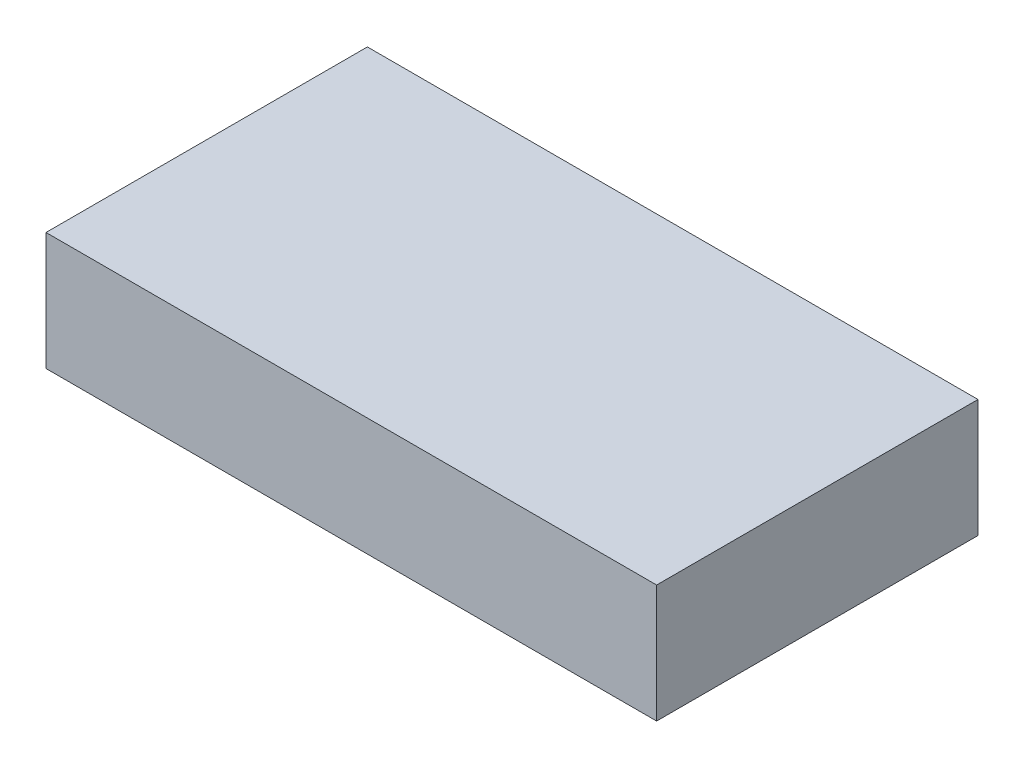
ISO-10303-21;
HEADER;
FILE_DESCRIPTION(('STEP AP214'),'2;1');
FILE_NAME('part.step','',(''),(''),'','','');
FILE_SCHEMA(('AUTOMOTIVE_DESIGN { 1 0 10303 214 1 1 1 1 }'));
ENDSEC;
DATA;
#1=APPLICATION_CONTEXT('core data for automotive mechanical design processes');
#2=APPLICATION_PROTOCOL_DEFINITION('international standard','automotive_design',2000,#1);
#3=PRODUCT_CONTEXT('',#1,'mechanical');
#4=PRODUCT('Part','Part','',(#3));
#5=PRODUCT_RELATED_PRODUCT_CATEGORY('part','',(#4));
#6=PRODUCT_DEFINITION_FORMATION('','',#4);
#7=PRODUCT_DEFINITION_CONTEXT('part definition',#1,'design');
#8=PRODUCT_DEFINITION('design','',#6,#7);
#9=PRODUCT_DEFINITION_SHAPE('','',#8);
#10=(LENGTH_UNIT() NAMED_UNIT(*) SI_UNIT(.MILLI.,.METRE.));
#11=(NAMED_UNIT(*) PLANE_ANGLE_UNIT() SI_UNIT($,.RADIAN.));
#12=(NAMED_UNIT(*) SI_UNIT($,.STERADIAN.) SOLID_ANGLE_UNIT());
#13=UNCERTAINTY_MEASURE_WITH_UNIT(LENGTH_MEASURE(1.E-05),#10,'distance_accuracy_value','');
#14=(GEOMETRIC_REPRESENTATION_CONTEXT(3) GLOBAL_UNCERTAINTY_ASSIGNED_CONTEXT((#13)) GLOBAL_UNIT_ASSIGNED_CONTEXT((#10,
#11,#12)) REPRESENTATION_CONTEXT('',''));
#15=CARTESIAN_POINT('',(0.,0.,0.));
#16=DIRECTION('',(0.,0.,1.));
#17=DIRECTION('',(1.,0.,0.));
#18=AXIS2_PLACEMENT_3D('',#15,#16,#17);
#19=CARTESIAN_POINT('',(57.912,5.588,15.24));
#20=DIRECTION('',(0.,0.,-1.));
#21=DIRECTION('',(0.,1.,0.));
#22=AXIS2_PLACEMENT_3D('',#19,#20,#21);
#23=PLANE('',#22);
#24=DIRECTION('',(0.,-1.,0.));
#25=VECTOR('',#24,1.);
#26=CARTESIAN_POINT('',(0.,5.588,15.24));
#27=LINE('',#26,#25);
#28=CARTESIAN_POINT('',(0.,5.588,15.24));
#29=VERTEX_POINT('',#28);
#30=CARTESIAN_POINT('',(0.,-5.588,15.24));
#31=VERTEX_POINT('',#30);
#32=EDGE_CURVE('E97',#29,#31,#27,.T.);
#33=ORIENTED_EDGE('',*,*,#32,.T.);
#34=DIRECTION('',(-1.,0.,0.));
#35=VECTOR('',#34,1.);
#36=CARTESIAN_POINT('',(57.912,-5.588,15.24));
#37=LINE('',#36,#35);
#38=CARTESIAN_POINT('',(57.912,-5.588,15.24));
#39=VERTEX_POINT('',#38);
#40=EDGE_CURVE('E11',#39,#31,#37,.T.);
#41=ORIENTED_EDGE('',*,*,#40,.F.);
#42=DIRECTION('',(0.,-1.,0.));
#43=VECTOR('',#42,1.);
#44=CARTESIAN_POINT('',(57.912,5.588,15.24));
#45=LINE('',#44,#43);
#46=CARTESIAN_POINT('',(57.912,5.588,15.24));
#47=VERTEX_POINT('',#46);
#48=EDGE_CURVE('E85',#47,#39,#45,.T.);
#49=ORIENTED_EDGE('',*,*,#48,.F.);
#50=DIRECTION('',(-1.,0.,0.));
#51=VECTOR('',#50,1.);
#52=CARTESIAN_POINT('',(57.912,5.588,15.24));
#53=LINE('',#52,#51);
#54=EDGE_CURVE('E93',#47,#29,#53,.T.);
#55=ORIENTED_EDGE('',*,*,#54,.T.);
#56=EDGE_LOOP('',(#33,#41,#49,#55));
#57=FACE_BOUND('',#56,.T.);
#58=ADVANCED_FACE('F34',(#57),#23,.F.);
#59=CARTESIAN_POINT('',(57.912,-5.588,15.24));
#60=DIRECTION('',(0.,1.,0.));
#61=DIRECTION('',(0.,0.,1.));
#62=AXIS2_PLACEMENT_3D('',#59,#60,#61);
#63=PLANE('',#62);
#64=DIRECTION('',(0.,0.,-1.));
#65=VECTOR('',#64,1.);
#66=CARTESIAN_POINT('',(0.,-5.588,15.24));
#67=LINE('',#66,#65);
#68=CARTESIAN_POINT('',(0.,-5.588,-15.24));
#69=VERTEX_POINT('',#68);
#70=EDGE_CURVE('E89',#31,#69,#67,.T.);
#71=ORIENTED_EDGE('',*,*,#70,.T.);
#72=DIRECTION('',(-1.,0.,0.));
#73=VECTOR('',#72,1.);
#74=CARTESIAN_POINT('',(57.912,-5.588,-15.24));
#75=LINE('',#74,#73);
#76=CARTESIAN_POINT('',(57.912,-5.588,-15.24));
#77=VERTEX_POINT('',#76);
#78=EDGE_CURVE('E42',#77,#69,#75,.T.);
#79=ORIENTED_EDGE('',*,*,#78,.F.);
#80=DIRECTION('',(0.,0.,-1.));
#81=VECTOR('',#80,1.);
#82=CARTESIAN_POINT('',(57.912,-5.588,15.24));
#83=LINE('',#82,#81);
#84=EDGE_CURVE('E80',#39,#77,#83,.T.);
#85=ORIENTED_EDGE('',*,*,#84,.F.);
#86=ORIENTED_EDGE('',*,*,#40,.T.);
#87=EDGE_LOOP('',(#71,#79,#85,#86));
#88=FACE_BOUND('',#87,.T.);
#89=ADVANCED_FACE('F88',(#88),#63,.F.);
#90=CARTESIAN_POINT('',(57.912,5.588,-15.24));
#91=DIRECTION('',(0.,0.,1.));
#92=DIRECTION('',(1.,0.,0.));
#93=AXIS2_PLACEMENT_3D('',#90,#91,#92);
#94=PLANE('',#93);
#95=DIRECTION('',(0.,1.,0.));
#96=VECTOR('',#95,1.);
#97=CARTESIAN_POINT('',(0.,5.588,-15.24));
#98=LINE('',#97,#96);
#99=CARTESIAN_POINT('',(0.,5.588,-15.24));
#100=VERTEX_POINT('',#99);
#101=EDGE_CURVE('E67',#69,#100,#98,.T.);
#102=ORIENTED_EDGE('',*,*,#101,.T.);
#103=DIRECTION('',(-1.,0.,0.));
#104=VECTOR('',#103,1.);
#105=CARTESIAN_POINT('',(57.912,5.588,-15.24));
#106=LINE('',#105,#104);
#107=CARTESIAN_POINT('',(57.912,5.588,-15.24));
#108=VERTEX_POINT('',#107);
#109=EDGE_CURVE('E90',#108,#100,#106,.T.);
#110=ORIENTED_EDGE('',*,*,#109,.F.);
#111=DIRECTION('',(0.,1.,0.));
#112=VECTOR('',#111,1.);
#113=CARTESIAN_POINT('',(57.912,5.588,-15.24));
#114=LINE('',#113,#112);
#115=EDGE_CURVE('E83',#77,#108,#114,.T.);
#116=ORIENTED_EDGE('',*,*,#115,.F.);
#117=ORIENTED_EDGE('',*,*,#78,.T.);
#118=EDGE_LOOP('',(#102,#110,#116,#117));
#119=FACE_BOUND('',#118,.T.);
#120=ADVANCED_FACE('F91',(#119),#94,.F.);
#121=CARTESIAN_POINT('',(57.912,5.588,15.24));
#122=DIRECTION('',(0.,-1.,0.));
#123=DIRECTION('',(0.,0.,-1.));
#124=AXIS2_PLACEMENT_3D('',#121,#122,#123);
#125=PLANE('',#124);
#126=DIRECTION('',(0.,0.,1.));
#127=VECTOR('',#126,1.);
#128=CARTESIAN_POINT('',(0.,5.588,15.24));
#129=LINE('',#128,#127);
#130=EDGE_CURVE('E73',#100,#29,#129,.T.);
#131=ORIENTED_EDGE('',*,*,#130,.T.);
#132=ORIENTED_EDGE('',*,*,#54,.F.);
#133=DIRECTION('',(0.,0.,1.));
#134=VECTOR('',#133,1.);
#135=CARTESIAN_POINT('',(57.912,5.588,15.24));
#136=LINE('',#135,#134);
#137=EDGE_CURVE('E50',#108,#47,#136,.T.);
#138=ORIENTED_EDGE('',*,*,#137,.F.);
#139=ORIENTED_EDGE('',*,*,#109,.T.);
#140=EDGE_LOOP('',(#131,#132,#138,#139));
#141=FACE_BOUND('',#140,.T.);
#142=ADVANCED_FACE('F104',(#141),#125,.F.);
#143=CARTESIAN_POINT('',(57.912,-5.588,15.24));
#144=DIRECTION('',(1.,0.,0.));
#145=DIRECTION('',(0.,0.,-1.));
#146=AXIS2_PLACEMENT_3D('',#143,#144,#145);
#147=PLANE('',#146);
#148=ORIENTED_EDGE('',*,*,#48,.T.);
#149=ORIENTED_EDGE('',*,*,#84,.T.);
#150=ORIENTED_EDGE('',*,*,#115,.T.);
#151=ORIENTED_EDGE('',*,*,#137,.T.);
#152=EDGE_LOOP('',(#148,#149,#150,#151));
#153=FACE_BOUND('',#152,.T.);
#154=ADVANCED_FACE('F81',(#153),#147,.T.);
#155=CARTESIAN_POINT('',(0.,-5.588,15.24));
#156=DIRECTION('',(1.,0.,0.));
#157=DIRECTION('',(0.,0.,-1.));
#158=AXIS2_PLACEMENT_3D('',#155,#156,#157);
#159=PLANE('',#158);
#160=ORIENTED_EDGE('',*,*,#32,.F.);
#161=ORIENTED_EDGE('',*,*,#130,.F.);
#162=ORIENTED_EDGE('',*,*,#101,.F.);
#163=ORIENTED_EDGE('',*,*,#70,.F.);
#164=EDGE_LOOP('',(#160,#161,#162,#163));
#165=FACE_BOUND('',#164,.T.);
#166=ADVANCED_FACE('F107',(#165),#159,.F.);
#167=CLOSED_SHELL('',(#58,#89,#120,#142,#154,#166));
#168=MANIFOLD_SOLID_BREP('B2',#167);
#169=ADVANCED_BREP_SHAPE_REPRESENTATION('',(#18,#168),#14);
#170=SHAPE_DEFINITION_REPRESENTATION(#9,#169);
ENDSEC;
END-ISO-10303-21;
